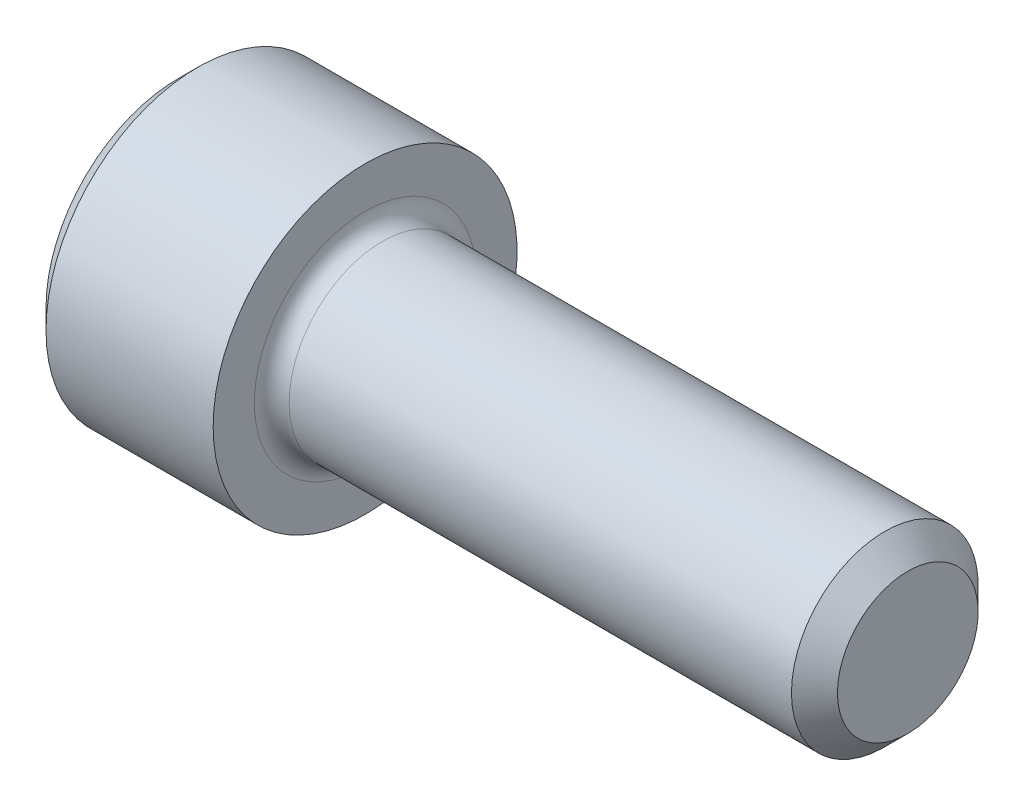
ISO-10303-21;
HEADER;
FILE_DESCRIPTION(('STEP AP214'),'2;1');
FILE_NAME('part.step','',(''),(''),'','','');
FILE_SCHEMA(('AUTOMOTIVE_DESIGN { 1 0 10303 214 1 1 1 1 }'));
ENDSEC;
DATA;
#1=APPLICATION_CONTEXT('core data for automotive mechanical design processes');
#2=APPLICATION_PROTOCOL_DEFINITION('international standard','automotive_design',2000,#1);
#3=PRODUCT_CONTEXT('',#1,'mechanical');
#4=PRODUCT('Part','Part','',(#3));
#5=PRODUCT_RELATED_PRODUCT_CATEGORY('part','',(#4));
#6=PRODUCT_DEFINITION_FORMATION('','',#4);
#7=PRODUCT_DEFINITION_CONTEXT('part definition',#1,'design');
#8=PRODUCT_DEFINITION('design','',#6,#7);
#9=PRODUCT_DEFINITION_SHAPE('','',#8);
#10=(LENGTH_UNIT() NAMED_UNIT(*) SI_UNIT(.MILLI.,.METRE.));
#11=(NAMED_UNIT(*) PLANE_ANGLE_UNIT() SI_UNIT($,.RADIAN.));
#12=(NAMED_UNIT(*) SI_UNIT($,.STERADIAN.) SOLID_ANGLE_UNIT());
#13=UNCERTAINTY_MEASURE_WITH_UNIT(LENGTH_MEASURE(1.E-05),#10,'distance_accuracy_value','');
#14=(GEOMETRIC_REPRESENTATION_CONTEXT(3) GLOBAL_UNCERTAINTY_ASSIGNED_CONTEXT((#13)) GLOBAL_UNIT_ASSIGNED_CONTEXT((#10,
#11,#12)) REPRESENTATION_CONTEXT('',''));
#15=CARTESIAN_POINT('',(0.,0.,0.));
#16=DIRECTION('',(0.,0.,1.));
#17=DIRECTION('',(1.,0.,0.));
#18=AXIS2_PLACEMENT_3D('',#15,#16,#17);
#19=CARTESIAN_POINT('',(0.,0.,0.));
#20=DIRECTION('',(-1.,0.,0.));
#21=DIRECTION('',(0.,0.,1.));
#22=AXIS2_PLACEMENT_3D('',#19,#20,#21);
#23=PLANE('',#22);
#24=DIRECTION('',(0.,-0.499999999999998,0.866025403784439));
#25=VECTOR('',#24,1.);
#26=CARTESIAN_POINT('',(0.,1.14384635331849,0.));
#27=LINE('',#26,#25);
#28=CARTESIAN_POINT('',(0.,1.14384635331849,0.));
#29=VERTEX_POINT('',#28);
#30=CARTESIAN_POINT('',(0.,0.571923176659249,0.990599999999998));
#31=VERTEX_POINT('',#30);
#32=EDGE_CURVE('E262',#29,#31,#27,.T.);
#33=ORIENTED_EDGE('',*,*,#32,.T.);
#34=DIRECTION('',(0.,1.,0.));
#35=VECTOR('',#34,1.);
#36=CARTESIAN_POINT('',(0.,-0.571923176659238,0.9906));
#37=LINE('',#36,#35);
#38=CARTESIAN_POINT('',(0.,-0.571923176659238,0.9906));
#39=VERTEX_POINT('',#38);
#40=EDGE_CURVE('E133',#39,#31,#37,.T.);
#41=ORIENTED_EDGE('',*,*,#40,.F.);
#42=DIRECTION('',(0.,-0.500000000000001,-0.866025403784438));
#43=VECTOR('',#42,1.);
#44=CARTESIAN_POINT('',(0.,-0.571923176659238,0.9906));
#45=LINE('',#44,#43);
#46=CARTESIAN_POINT('',(0.,-1.14384635331848,0.));
#47=VERTEX_POINT('',#46);
#48=EDGE_CURVE('E265',#39,#47,#45,.T.);
#49=ORIENTED_EDGE('',*,*,#48,.T.);
#50=DIRECTION('',(0.,0.499999999999998,-0.86602540378444));
#51=VECTOR('',#50,1.);
#52=CARTESIAN_POINT('',(0.,-1.14384635331848,0.));
#53=LINE('',#52,#51);
#54=CARTESIAN_POINT('',(0.,-0.571923176659241,-0.9906));
#55=VERTEX_POINT('',#54);
#56=EDGE_CURVE('E268',#47,#55,#53,.T.);
#57=ORIENTED_EDGE('',*,*,#56,.T.);
#58=DIRECTION('',(0.,-1.,0.));
#59=VECTOR('',#58,1.);
#60=CARTESIAN_POINT('',(0.,0.571923176659246,-0.990600000000002));
#61=LINE('',#60,#59);
#62=CARTESIAN_POINT('',(0.,0.571923176659246,-0.990600000000002));
#63=VERTEX_POINT('',#62);
#64=EDGE_CURVE('E271',#63,#55,#61,.T.);
#65=ORIENTED_EDGE('',*,*,#64,.F.);
#66=DIRECTION('',(0.,-0.500000000000001,-0.866025403784438));
#67=VECTOR('',#66,1.);
#68=CARTESIAN_POINT('',(0.,1.14384635331849,0.));
#69=LINE('',#68,#67);
#70=EDGE_CURVE('E128',#29,#63,#69,.T.);
#71=ORIENTED_EDGE('',*,*,#70,.F.);
#72=EDGE_LOOP('',(#33,#41,#49,#57,#65,#71));
#73=FACE_BOUND('',#72,.T.);
#74=CARTESIAN_POINT('',(0.,0.,0.));
#75=DIRECTION('',(-1.,0.,0.));
#76=DIRECTION('',(0.,0.,1.));
#77=AXIS2_PLACEMENT_3D('',#74,#75,#76);
#78=CIRCLE('',#77,1.5494);
#79=CARTESIAN_POINT('',(0.,0.,1.5494));
#80=VERTEX_POINT('',#79);
#81=EDGE_CURVE('E157',#80,#80,#78,.T.);
#82=ORIENTED_EDGE('',*,*,#81,.T.);
#83=EDGE_LOOP('',(#82));
#84=FACE_BOUND('',#83,.T.);
#85=ADVANCED_FACE('F37',(#73,#84),#23,.T.);
#86=CARTESIAN_POINT('',(0.,0.,0.));
#87=DIRECTION('',(1.,0.,0.));
#88=DIRECTION('',(0.,0.,-1.));
#89=AXIS2_PLACEMENT_3D('',#86,#87,#88);
#90=CONICAL_SURFACE('',#89,1.5494,0.785398163397442);
#91=CARTESIAN_POINT('',(0.228600000000002,0.,0.));
#92=DIRECTION('',(-1.,0.,0.));
#93=DIRECTION('',(0.,0.,1.));
#94=AXIS2_PLACEMENT_3D('',#91,#92,#93);
#95=CIRCLE('',#94,1.778);
#96=CARTESIAN_POINT('',(0.228600000000002,0.,1.778));
#97=VERTEX_POINT('',#96);
#98=EDGE_CURVE('E154',#97,#97,#95,.T.);
#99=ORIENTED_EDGE('',*,*,#98,.T.);
#100=EDGE_LOOP('',(#99));
#101=FACE_BOUND('',#100,.T.);
#102=ORIENTED_EDGE('',*,*,#81,.F.);
#103=EDGE_LOOP('',(#102));
#104=FACE_BOUND('',#103,.T.);
#105=ADVANCED_FACE('F178',(#101,#104),#90,.T.);
#106=CARTESIAN_POINT('',(-31.75,0.,0.));
#107=DIRECTION('',(-1.,0.,0.));
#108=DIRECTION('',(0.,0.,1.));
#109=AXIS2_PLACEMENT_3D('',#106,#107,#108);
#110=CYLINDRICAL_SURFACE('',#109,1.778);
#111=CARTESIAN_POINT('',(2.1844,0.,0.));
#112=DIRECTION('',(-1.,0.,0.));
#113=DIRECTION('',(0.,0.,1.));
#114=AXIS2_PLACEMENT_3D('',#111,#112,#113);
#115=CIRCLE('',#114,1.778);
#116=CARTESIAN_POINT('',(2.1844,0.,1.778));
#117=VERTEX_POINT('',#116);
#118=EDGE_CURVE('E151',#117,#117,#115,.T.);
#119=ORIENTED_EDGE('',*,*,#118,.T.);
#120=EDGE_LOOP('',(#119));
#121=FACE_BOUND('',#120,.T.);
#122=ORIENTED_EDGE('',*,*,#98,.F.);
#123=EDGE_LOOP('',(#122));
#124=FACE_BOUND('',#123,.T.);
#125=ADVANCED_FACE('F183',(#121,#124),#110,.T.);
#126=CARTESIAN_POINT('',(2.1844,1.778,0.));
#127=DIRECTION('',(1.,0.,0.));
#128=DIRECTION('',(0.,0.,-1.));
#129=AXIS2_PLACEMENT_3D('',#126,#127,#128);
#130=PLANE('',#129);
#131=CARTESIAN_POINT('',(2.1844,0.,0.));
#132=DIRECTION('',(1.,0.,0.));
#133=DIRECTION('',(0.,0.,-1.));
#134=AXIS2_PLACEMENT_3D('',#131,#132,#133);
#135=CIRCLE('',#134,1.29539999999999);
#136=CARTESIAN_POINT('',(2.1844,0.,-1.29539999999999));
#137=VERTEX_POINT('',#136);
#138=EDGE_CURVE('E45',#137,#137,#135,.F.);
#139=ORIENTED_EDGE('',*,*,#138,.T.);
#140=EDGE_LOOP('',(#139));
#141=FACE_BOUND('',#140,.T.);
#142=ORIENTED_EDGE('',*,*,#118,.F.);
#143=EDGE_LOOP('',(#142));
#144=FACE_BOUND('',#143,.T.);
#145=ADVANCED_FACE('F162',(#141,#144),#130,.T.);
#146=CARTESIAN_POINT('',(-31.75,0.,0.));
#147=DIRECTION('',(-1.,0.,0.));
#148=DIRECTION('',(0.,0.,1.));
#149=AXIS2_PLACEMENT_3D('',#146,#147,#148);
#150=CYLINDRICAL_SURFACE('',#149,1.09219999999999);
#151=CARTESIAN_POINT('',(2.3876,0.,0.));
#152=DIRECTION('',(1.,0.,0.));
#153=DIRECTION('',(0.,0.,-1.));
#154=AXIS2_PLACEMENT_3D('',#151,#152,#153);
#155=CIRCLE('',#154,1.09219999999999);
#156=CARTESIAN_POINT('',(2.3876,0.,-1.09219999999999));
#157=VERTEX_POINT('',#156);
#158=EDGE_CURVE('E11',#157,#157,#155,.T.);
#159=ORIENTED_EDGE('',*,*,#158,.T.);
#160=EDGE_LOOP('',(#159));
#161=FACE_BOUND('',#160,.T.);
#162=CARTESIAN_POINT('',(8.26515999999999,0.,0.));
#163=DIRECTION('',(-1.,0.,0.));
#164=DIRECTION('',(0.,0.,1.));
#165=AXIS2_PLACEMENT_3D('',#162,#163,#164);
#166=CIRCLE('',#165,1.09219999999998);
#167=CARTESIAN_POINT('',(8.26515999999999,0.,1.09219999999998));
#168=VERTEX_POINT('',#167);
#169=EDGE_CURVE('E148',#168,#168,#166,.T.);
#170=ORIENTED_EDGE('',*,*,#169,.T.);
#171=EDGE_LOOP('',(#170));
#172=FACE_BOUND('',#171,.T.);
#173=ADVANCED_FACE('F193',(#161,#172),#150,.T.);
#174=CARTESIAN_POINT('',(8.5344,0.,0.));
#175=DIRECTION('',(-1.,0.,0.));
#176=DIRECTION('',(0.,0.,1.));
#177=AXIS2_PLACEMENT_3D('',#174,#175,#176);
#178=CONICAL_SURFACE('',#177,0.82296,0.785398163397413);
#179=ORIENTED_EDGE('',*,*,#169,.F.);
#180=EDGE_LOOP('',(#179));
#181=FACE_BOUND('',#180,.T.);
#182=CARTESIAN_POINT('',(8.5344,0.,0.));
#183=DIRECTION('',(-1.,0.,0.));
#184=DIRECTION('',(0.,0.,1.));
#185=AXIS2_PLACEMENT_3D('',#182,#183,#184);
#186=CIRCLE('',#185,0.82296);
#187=CARTESIAN_POINT('',(8.5344,0.,0.82296));
#188=VERTEX_POINT('',#187);
#189=EDGE_CURVE('E144',#188,#188,#186,.T.);
#190=ORIENTED_EDGE('',*,*,#189,.T.);
#191=EDGE_LOOP('',(#190));
#192=FACE_BOUND('',#191,.T.);
#193=ADVANCED_FACE('F173',(#181,#192),#178,.T.);
#194=CARTESIAN_POINT('',(8.5344,0.82296,0.));
#195=DIRECTION('',(1.,0.,0.));
#196=DIRECTION('',(0.,0.,-1.));
#197=AXIS2_PLACEMENT_3D('',#194,#195,#196);
#198=PLANE('',#197);
#199=ORIENTED_EDGE('',*,*,#189,.F.);
#200=EDGE_LOOP('',(#199));
#201=FACE_BOUND('',#200,.T.);
#202=ADVANCED_FACE('F166',(#201),#198,.T.);
#203=CARTESIAN_POINT('',(2.3876,0.,0.));
#204=DIRECTION('',(1.,0.,0.));
#205=DIRECTION('',(0.,0.,-1.));
#206=AXIS2_PLACEMENT_3D('',#203,#204,#205);
#207=TOROIDAL_SURFACE('',#206,1.29539999999999,0.2032);
#208=ORIENTED_EDGE('',*,*,#158,.F.);
#209=EDGE_LOOP('',(#208));
#210=FACE_BOUND('',#209,.T.);
#211=ORIENTED_EDGE('',*,*,#138,.F.);
#212=EDGE_LOOP('',(#211));
#213=FACE_BOUND('',#212,.T.);
#214=ADVANCED_FACE('F39',(#210,#213),#207,.F.);
#215=CARTESIAN_POINT('',(0.9652,1.14384635331849,0.));
#216=DIRECTION('',(0.,-0.866025403784439,-0.499999999999998));
#217=DIRECTION('',(0.,0.499999999999999,-0.86602540378444));
#218=AXIS2_PLACEMENT_3D('',#215,#216,#217);
#219=PLANE('',#218);
#220=ORIENTED_EDGE('',*,*,#32,.F.);
#221=DIRECTION('',(-1.,0.,0.));
#222=VECTOR('',#221,1.);
#223=CARTESIAN_POINT('',(0.9652,1.14384635331849,0.));
#224=LINE('',#223,#222);
#225=CARTESIAN_POINT('',(0.9652,1.14384635331849,0.));
#226=VERTEX_POINT('',#225);
#227=EDGE_CURVE('E252',#226,#29,#224,.T.);
#228=ORIENTED_EDGE('',*,*,#227,.F.);
#229=DIRECTION('',(0.,-0.499999999999998,0.866025403784439));
#230=VECTOR('',#229,1.);
#231=CARTESIAN_POINT('',(0.9652,1.14384635331849,0.));
#232=LINE('',#231,#230);
#233=CARTESIAN_POINT('',(0.9652,0.857884764988868,0.4953));
#234=VERTEX_POINT('',#233);
#235=EDGE_CURVE('E120',#226,#234,#232,.T.);
#236=ORIENTED_EDGE('',*,*,#235,.T.);
#237=CARTESIAN_POINT('',(0.9652,0.571923176659249,0.990599999999998));
#238=VERTEX_POINT('',#237);
#239=EDGE_CURVE('E111',#234,#238,#232,.T.);
#240=ORIENTED_EDGE('',*,*,#239,.T.);
#241=DIRECTION('',(-1.,0.,0.));
#242=VECTOR('',#241,1.);
#243=CARTESIAN_POINT('',(0.9652,0.571923176659249,0.990599999999998));
#244=LINE('',#243,#242);
#245=EDGE_CURVE('E125',#238,#31,#244,.T.);
#246=ORIENTED_EDGE('',*,*,#245,.T.);
#247=EDGE_LOOP('',(#220,#228,#236,#240,#246));
#248=FACE_BOUND('',#247,.T.);
#249=ADVANCED_FACE('F124',(#248),#219,.T.);
#250=CARTESIAN_POINT('',(0.9652,-0.571923176659238,0.9906));
#251=DIRECTION('',(0.,0.,1.));
#252=DIRECTION('',(0.,-1.,0.));
#253=AXIS2_PLACEMENT_3D('',#250,#251,#252);
#254=PLANE('',#253);
#255=ORIENTED_EDGE('',*,*,#40,.T.);
#256=ORIENTED_EDGE('',*,*,#245,.F.);
#257=DIRECTION('',(0.,1.,0.));
#258=VECTOR('',#257,1.);
#259=CARTESIAN_POINT('',(0.9652,-0.571923176659238,0.9906));
#260=LINE('',#259,#258);
#261=CARTESIAN_POINT('',(0.9652,0.,0.990599999999999));
#262=VERTEX_POINT('',#261);
#263=EDGE_CURVE('E108',#262,#238,#260,.T.);
#264=ORIENTED_EDGE('',*,*,#263,.F.);
#265=CARTESIAN_POINT('',(0.9652,-0.571923176659238,0.9906));
#266=VERTEX_POINT('',#265);
#267=EDGE_CURVE('E119',#266,#262,#260,.T.);
#268=ORIENTED_EDGE('',*,*,#267,.F.);
#269=DIRECTION('',(-1.,0.,0.));
#270=VECTOR('',#269,1.);
#271=CARTESIAN_POINT('',(0.9652,-0.571923176659238,0.9906));
#272=LINE('',#271,#270);
#273=EDGE_CURVE('E135',#266,#39,#272,.T.);
#274=ORIENTED_EDGE('',*,*,#273,.T.);
#275=EDGE_LOOP('',(#255,#256,#264,#268,#274));
#276=FACE_BOUND('',#275,.T.);
#277=ADVANCED_FACE('F130',(#276),#254,.F.);
#278=CARTESIAN_POINT('',(0.9652,-0.571923176659238,0.9906));
#279=DIRECTION('',(0.,0.866025403784438,-0.500000000000001));
#280=DIRECTION('',(0.,0.500000000000001,0.866025403784438));
#281=AXIS2_PLACEMENT_3D('',#278,#279,#280);
#282=PLANE('',#281);
#283=ORIENTED_EDGE('',*,*,#48,.F.);
#284=ORIENTED_EDGE('',*,*,#273,.F.);
#285=DIRECTION('',(0.,-0.500000000000001,-0.866025403784438));
#286=VECTOR('',#285,1.);
#287=CARTESIAN_POINT('',(0.9652,-0.571923176659238,0.9906));
#288=LINE('',#287,#286);
#289=CARTESIAN_POINT('',(0.9652,-0.85788476498886,0.495299999999999));
#290=VERTEX_POINT('',#289);
#291=EDGE_CURVE('E291',#266,#290,#288,.T.);
#292=ORIENTED_EDGE('',*,*,#291,.T.);
#293=CARTESIAN_POINT('',(0.9652,-1.14384635331848,0.));
#294=VERTEX_POINT('',#293);
#295=EDGE_CURVE('E280',#290,#294,#288,.T.);
#296=ORIENTED_EDGE('',*,*,#295,.T.);
#297=DIRECTION('',(-1.,0.,0.));
#298=VECTOR('',#297,1.);
#299=CARTESIAN_POINT('',(0.9652,-1.14384635331848,0.));
#300=LINE('',#299,#298);
#301=EDGE_CURVE('E140',#294,#47,#300,.T.);
#302=ORIENTED_EDGE('',*,*,#301,.T.);
#303=EDGE_LOOP('',(#283,#284,#292,#296,#302));
#304=FACE_BOUND('',#303,.T.);
#305=ADVANCED_FACE('F206',(#304),#282,.T.);
#306=CARTESIAN_POINT('',(0.9652,-1.14384635331848,0.));
#307=DIRECTION('',(0.,0.86602540378444,0.499999999999998));
#308=DIRECTION('',(0.,-0.499999999999998,0.86602540378444));
#309=AXIS2_PLACEMENT_3D('',#306,#307,#308);
#310=PLANE('',#309);
#311=ORIENTED_EDGE('',*,*,#56,.F.);
#312=ORIENTED_EDGE('',*,*,#301,.F.);
#313=DIRECTION('',(0.,0.499999999999998,-0.86602540378444));
#314=VECTOR('',#313,1.);
#315=CARTESIAN_POINT('',(0.9652,-1.14384635331848,0.));
#316=LINE('',#315,#314);
#317=CARTESIAN_POINT('',(0.9652,-0.857884764988863,-0.495299999999997));
#318=VERTEX_POINT('',#317);
#319=EDGE_CURVE('E258',#294,#318,#316,.T.);
#320=ORIENTED_EDGE('',*,*,#319,.T.);
#321=CARTESIAN_POINT('',(0.9652,-0.571923176659241,-0.9906));
#322=VERTEX_POINT('',#321);
#323=EDGE_CURVE('E290',#318,#322,#316,.T.);
#324=ORIENTED_EDGE('',*,*,#323,.T.);
#325=DIRECTION('',(-1.,0.,0.));
#326=VECTOR('',#325,1.);
#327=CARTESIAN_POINT('',(0.9652,-0.571923176659241,-0.9906));
#328=LINE('',#327,#326);
#329=EDGE_CURVE('E251',#322,#55,#328,.T.);
#330=ORIENTED_EDGE('',*,*,#329,.T.);
#331=EDGE_LOOP('',(#311,#312,#320,#324,#330));
#332=FACE_BOUND('',#331,.T.);
#333=ADVANCED_FACE('F209',(#332),#310,.T.);
#334=CARTESIAN_POINT('',(0.9652,0.571923176659246,-0.990600000000002));
#335=DIRECTION('',(0.,0.,-1.));
#336=DIRECTION('',(0.,1.,0.));
#337=AXIS2_PLACEMENT_3D('',#334,#335,#336);
#338=PLANE('',#337);
#339=ORIENTED_EDGE('',*,*,#64,.T.);
#340=ORIENTED_EDGE('',*,*,#329,.F.);
#341=DIRECTION('',(0.,-1.,0.));
#342=VECTOR('',#341,1.);
#343=CARTESIAN_POINT('',(0.9652,0.571923176659246,-0.990600000000002));
#344=LINE('',#343,#342);
#345=CARTESIAN_POINT('',(0.965200000000003,0.,-0.990599999999999));
#346=VERTEX_POINT('',#345);
#347=EDGE_CURVE('E255',#346,#322,#344,.T.);
#348=ORIENTED_EDGE('',*,*,#347,.F.);
#349=CARTESIAN_POINT('',(0.9652,0.571923176659246,-0.990600000000002));
#350=VERTEX_POINT('',#349);
#351=EDGE_CURVE('E52',#350,#346,#344,.T.);
#352=ORIENTED_EDGE('',*,*,#351,.F.);
#353=DIRECTION('',(-1.,0.,0.));
#354=VECTOR('',#353,1.);
#355=CARTESIAN_POINT('',(0.9652,0.571923176659246,-0.990600000000002));
#356=LINE('',#355,#354);
#357=EDGE_CURVE('E248',#350,#63,#356,.T.);
#358=ORIENTED_EDGE('',*,*,#357,.T.);
#359=EDGE_LOOP('',(#339,#340,#348,#352,#358));
#360=FACE_BOUND('',#359,.T.);
#361=ADVANCED_FACE('F213',(#360),#338,.F.);
#362=CARTESIAN_POINT('',(0.9652,1.14384635331849,0.));
#363=DIRECTION('',(0.,0.866025403784438,-0.500000000000001));
#364=DIRECTION('',(0.,0.500000000000001,0.866025403784438));
#365=AXIS2_PLACEMENT_3D('',#362,#363,#364);
#366=PLANE('',#365);
#367=ORIENTED_EDGE('',*,*,#70,.T.);
#368=ORIENTED_EDGE('',*,*,#357,.F.);
#369=DIRECTION('',(0.,-0.500000000000001,-0.866025403784438));
#370=VECTOR('',#369,1.);
#371=CARTESIAN_POINT('',(0.9652,1.14384635331849,0.));
#372=LINE('',#371,#370);
#373=CARTESIAN_POINT('',(0.9652,0.857884764988868,-0.495300000000003));
#374=VERTEX_POINT('',#373);
#375=EDGE_CURVE('E238',#374,#350,#372,.T.);
#376=ORIENTED_EDGE('',*,*,#375,.F.);
#377=EDGE_CURVE('E244',#226,#374,#372,.T.);
#378=ORIENTED_EDGE('',*,*,#377,.F.);
#379=ORIENTED_EDGE('',*,*,#227,.T.);
#380=EDGE_LOOP('',(#367,#368,#376,#378,#379));
#381=FACE_BOUND('',#380,.T.);
#382=ADVANCED_FACE('F217',(#381),#366,.F.);
#383=CARTESIAN_POINT('',(0.9652,1.71576952997773,-0.990600000000003));
#384=DIRECTION('',(1.,0.,0.));
#385=DIRECTION('',(0.,0.,-1.));
#386=AXIS2_PLACEMENT_3D('',#383,#384,#385);
#387=PLANE('',#386);
#388=ORIENTED_EDGE('',*,*,#347,.T.);
#389=ORIENTED_EDGE('',*,*,#323,.F.);
#390=CARTESIAN_POINT('',(0.965200000000003,0.,0.));
#391=DIRECTION('',(-1.,0.,0.));
#392=DIRECTION('',(0.,0.,1.));
#393=AXIS2_PLACEMENT_3D('',#390,#391,#392);
#394=CIRCLE('',#393,0.990599999999999);
#395=EDGE_CURVE('E286',#346,#318,#394,.T.);
#396=ORIENTED_EDGE('',*,*,#395,.F.);
#397=EDGE_LOOP('',(#388,#389,#396));
#398=FACE_BOUND('',#397,.T.);
#399=ADVANCED_FACE('F221',(#398),#387,.F.);
#400=ORIENTED_EDGE('',*,*,#319,.F.);
#401=ORIENTED_EDGE('',*,*,#295,.F.);
#402=EDGE_CURVE('E138',#318,#290,#394,.T.);
#403=ORIENTED_EDGE('',*,*,#402,.F.);
#404=EDGE_LOOP('',(#400,#401,#403));
#405=FACE_BOUND('',#404,.T.);
#406=ADVANCED_FACE('F224',(#405),#387,.F.);
#407=ORIENTED_EDGE('',*,*,#291,.F.);
#408=ORIENTED_EDGE('',*,*,#267,.T.);
#409=EDGE_CURVE('E134',#290,#262,#394,.T.);
#410=ORIENTED_EDGE('',*,*,#409,.F.);
#411=EDGE_LOOP('',(#407,#408,#410));
#412=FACE_BOUND('',#411,.T.);
#413=ADVANCED_FACE('F229',(#412),#387,.F.);
#414=ORIENTED_EDGE('',*,*,#263,.T.);
#415=ORIENTED_EDGE('',*,*,#239,.F.);
#416=EDGE_CURVE('E114',#262,#234,#394,.T.);
#417=ORIENTED_EDGE('',*,*,#416,.F.);
#418=EDGE_LOOP('',(#414,#415,#417));
#419=FACE_BOUND('',#418,.T.);
#420=ADVANCED_FACE('F110',(#419),#387,.F.);
#421=ORIENTED_EDGE('',*,*,#235,.F.);
#422=ORIENTED_EDGE('',*,*,#377,.T.);
#423=EDGE_CURVE('E145',#234,#374,#394,.T.);
#424=ORIENTED_EDGE('',*,*,#423,.F.);
#425=EDGE_LOOP('',(#421,#422,#424));
#426=FACE_BOUND('',#425,.T.);
#427=ADVANCED_FACE('F232',(#426),#387,.F.);
#428=ORIENTED_EDGE('',*,*,#375,.T.);
#429=ORIENTED_EDGE('',*,*,#351,.T.);
#430=EDGE_CURVE('E241',#374,#346,#394,.T.);
#431=ORIENTED_EDGE('',*,*,#430,.F.);
#432=EDGE_LOOP('',(#428,#429,#431));
#433=FACE_BOUND('',#432,.T.);
#434=ADVANCED_FACE('F202',(#433),#387,.F.);
#435=CARTESIAN_POINT('',(0.965200000000003,0.,0.));
#436=DIRECTION('',(-1.,0.,0.));
#437=DIRECTION('',(0.,0.,1.));
#438=AXIS2_PLACEMENT_3D('',#435,#436,#437);
#439=CONICAL_SURFACE('',#438,0.990599999999999,1.04719755119659);
#440=CARTESIAN_POINT('',(1.53712317665926,0.,0.));
#441=VERTEX_POINT('',#440);
#442=VERTEX_LOOP('',#441);
#443=FACE_BOUND('',#442,.T.);
#444=ORIENTED_EDGE('',*,*,#416,.T.);
#445=ORIENTED_EDGE('',*,*,#423,.T.);
#446=ORIENTED_EDGE('',*,*,#430,.T.);
#447=ORIENTED_EDGE('',*,*,#395,.T.);
#448=ORIENTED_EDGE('',*,*,#402,.T.);
#449=ORIENTED_EDGE('',*,*,#409,.T.);
#450=EDGE_LOOP('',(#444,#445,#446,#447,#448,#449));
#451=FACE_BOUND('',#450,.T.);
#452=ADVANCED_FACE('F200',(#443,#451),#439,.F.);
#453=CLOSED_SHELL('',(#85,#105,#125,#145,#173,#193,#202,#214,#249,#277,#305,#333,#361,#382,#399,
#406,#413,#420,#427,#434,#452));
#454=MANIFOLD_SOLID_BREP('B2',#453);
#455=ADVANCED_BREP_SHAPE_REPRESENTATION('',(#18,#454),#14);
#456=SHAPE_DEFINITION_REPRESENTATION(#9,#455);
ENDSEC;
END-ISO-10303-21;
